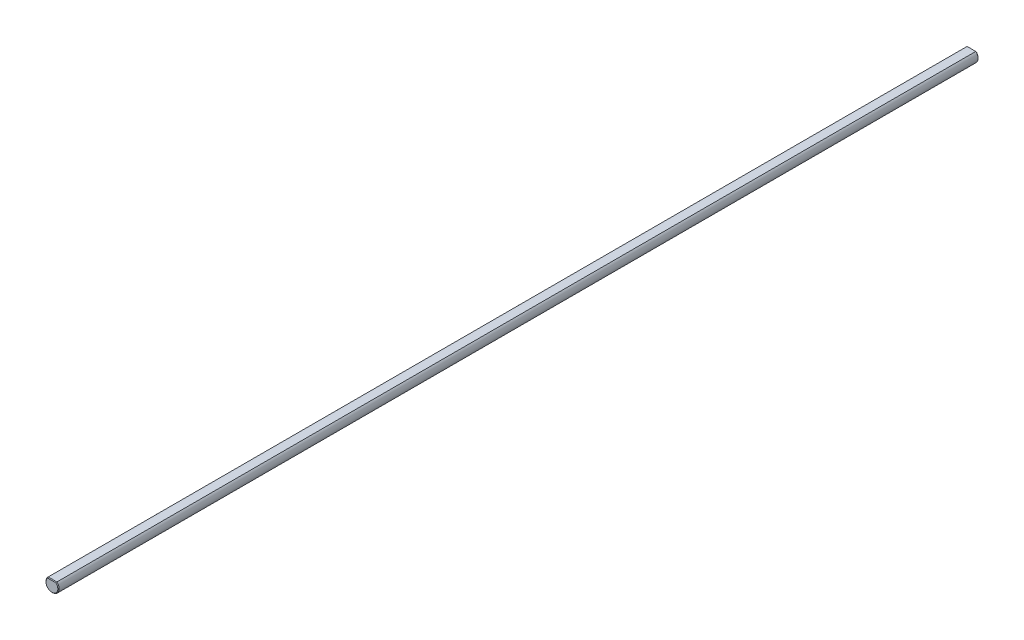
ISO-10303-21;
HEADER;
FILE_DESCRIPTION(('STEP AP214'),'2;1');
FILE_NAME('part.step','',(''),(''),'','','');
FILE_SCHEMA(('AUTOMOTIVE_DESIGN { 1 0 10303 214 1 1 1 1 }'));
ENDSEC;
DATA;
#1=APPLICATION_CONTEXT('core data for automotive mechanical design processes');
#2=APPLICATION_PROTOCOL_DEFINITION('international standard','automotive_design',2000,#1);
#3=PRODUCT_CONTEXT('',#1,'mechanical');
#4=PRODUCT('Part','Part','',(#3));
#5=PRODUCT_RELATED_PRODUCT_CATEGORY('part','',(#4));
#6=PRODUCT_DEFINITION_FORMATION('','',#4);
#7=PRODUCT_DEFINITION_CONTEXT('part definition',#1,'design');
#8=PRODUCT_DEFINITION('design','',#6,#7);
#9=PRODUCT_DEFINITION_SHAPE('','',#8);
#10=(LENGTH_UNIT() NAMED_UNIT(*) SI_UNIT(.MILLI.,.METRE.));
#11=(NAMED_UNIT(*) PLANE_ANGLE_UNIT() SI_UNIT($,.RADIAN.));
#12=(NAMED_UNIT(*) SI_UNIT($,.STERADIAN.) SOLID_ANGLE_UNIT());
#13=UNCERTAINTY_MEASURE_WITH_UNIT(LENGTH_MEASURE(1.E-05),#10,'distance_accuracy_value','');
#14=(GEOMETRIC_REPRESENTATION_CONTEXT(3) GLOBAL_UNCERTAINTY_ASSIGNED_CONTEXT((#13)) GLOBAL_UNIT_ASSIGNED_CONTEXT((#10,
#11,#12)) REPRESENTATION_CONTEXT('',''));
#15=CARTESIAN_POINT('',(0.,0.,0.));
#16=DIRECTION('',(0.,0.,1.));
#17=DIRECTION('',(1.,0.,0.));
#18=AXIS2_PLACEMENT_3D('',#15,#16,#17);
#19=CARTESIAN_POINT('',(0.,1.5,279.8));
#20=DIRECTION('',(0.,-0.707106781186597,-0.707106781186499));
#21=DIRECTION('',(0.,0.707106781186499,-0.707106781186597));
#22=AXIS2_PLACEMENT_3D('',#19,#20,#21);
#23=PLANE('',#22);
#24=CARTESIAN_POINT('',(-1.2449899597781,1.30000000003631,279.999999999965));
#25=CARTESIAN_POINT('',(-1.25833682018695,1.33326211369836,279.966737886302));
#26=CARTESIAN_POINT('',(-1.27150073004347,1.36655985043773,279.933440149563));
#27=CARTESIAN_POINT('',(-1.29746262806258,1.43322651720057,279.866773482799));
#28=CARTESIAN_POINT('',(-1.31026061680553,1.46659544711103,279.833404552889));
#29=CARTESIAN_POINT('',(-1.32287565557651,1.4999999999858,279.800000000014));
#30=B_SPLINE_CURVE_WITH_KNOTS('',3,(#24,#25,#26,#27,#28,#29),.UNSPECIFIED.,.F.,.F.,(4,2,4),(0.,
0.146686412458475,0.293372592255438),.UNSPECIFIED.);
#31=CARTESIAN_POINT('',(-1.24498995986547,1.30000000000005,279.99999999993));
#32=VERTEX_POINT('',#31);
#33=CARTESIAN_POINT('',(-1.3228756555568,1.5,279.8));
#34=VERTEX_POINT('',#33);
#35=EDGE_CURVE('E100',#32,#34,#30,.T.);
#36=ORIENTED_EDGE('',*,*,#35,.F.);
#37=DIRECTION('',(1.,0.,0.));
#38=VECTOR('',#37,1.);
#39=CARTESIAN_POINT('',(0.,1.30000000000005,280.));
#40=LINE('',#39,#38);
#41=CARTESIAN_POINT('',(1.24498995978626,1.30000000000745,279.999999999979));
#42=VERTEX_POINT('',#41);
#43=EDGE_CURVE('E76',#42,#32,#40,.F.);
#44=ORIENTED_EDGE('',*,*,#43,.F.);
#45=CARTESIAN_POINT('',(1.32287565557637,1.49999999998694,279.800000000013));
#46=CARTESIAN_POINT('',(1.31026061680422,1.46659544710851,279.833404552892));
#47=CARTESIAN_POINT('',(1.29746262806002,1.43322651719432,279.866773482806));
#48=CARTESIAN_POINT('',(1.27150073003822,1.36655985042392,279.933440149576));
#49=CARTESIAN_POINT('',(1.25833682018026,1.3332621136807,279.966737886319));
#50=CARTESIAN_POINT('',(1.24498995976989,1.30000000001474,279.999999999985));
#51=B_SPLINE_CURVE_WITH_KNOTS('',3,(#45,#46,#47,#48,#49,#50),.UNSPECIFIED.,.F.,.F.,(4,2,4),(0.,
0.146686179813228,0.29337259228794),.UNSPECIFIED.);
#52=CARTESIAN_POINT('',(1.32287565554286,1.50000000000359,279.80000000001));
#53=VERTEX_POINT('',#52);
#54=EDGE_CURVE('E21',#53,#42,#51,.T.);
#55=ORIENTED_EDGE('',*,*,#54,.F.);
#56=DIRECTION('',(1.,0.,0.));
#57=VECTOR('',#56,1.);
#58=CARTESIAN_POINT('',(0.,1.5,279.8));
#59=LINE('',#58,#57);
#60=EDGE_CURVE('E75',#34,#53,#59,.T.);
#61=ORIENTED_EDGE('',*,*,#60,.F.);
#62=EDGE_LOOP('',(#36,#44,#55,#61));
#63=FACE_BOUND('',#62,.T.);
#64=ADVANCED_FACE('F17',(#63),#23,.F.);
#65=CARTESIAN_POINT('',(0.,1.29999999999997,0.));
#66=DIRECTION('',(0.,0.707106781186449,-0.707106781186646));
#67=DIRECTION('',(0.,0.707106781186646,0.707106781186449));
#68=AXIS2_PLACEMENT_3D('',#65,#66,#67);
#69=PLANE('',#68);
#70=CARTESIAN_POINT('',(1.24498995957328,1.3000000000416,2.67935920497978E-11));
#71=CARTESIAN_POINT('',(1.25833681998276,1.33326211370927,0.0332621137018782));
#72=CARTESIAN_POINT('',(1.27150072984026,1.36655985045535,0.0665598504528936));
#73=CARTESIAN_POINT('',(1.29746262786203,1.43322651723378,0.133226517236245));
#74=CARTESIAN_POINT('',(1.31026061660665,1.46659544715312,0.166595447155577));
#75=CARTESIAN_POINT('',(1.32287565537966,1.50000000003786,0.200000000037835));
#76=B_SPLINE_CURVE_WITH_KNOTS('',3,(#70,#71,#72,#73,#74,#75),.UNSPECIFIED.,.F.,.F.,(4,2,4),(0.,
0.14668641249614,0.293372592330764),.UNSPECIFIED.);
#77=CARTESIAN_POINT('',(1.24498995959666,1.30000000002499,4.58049803777768E-11));
#78=VERTEX_POINT('',#77);
#79=CARTESIAN_POINT('',(1.32287565544854,1.5,0.199999999999978));
#80=VERTEX_POINT('',#79);
#81=EDGE_CURVE('E80',#78,#80,#76,.T.);
#82=ORIENTED_EDGE('',*,*,#81,.F.);
#83=DIRECTION('',(1.,0.,0.));
#84=VECTOR('',#83,1.);
#85=CARTESIAN_POINT('',(0.,1.30000000001525,0.));
#86=LINE('',#85,#84);
#87=CARTESIAN_POINT('',(-1.24498995959666,1.30000000002499,4.5805115463277E-11));
#88=VERTEX_POINT('',#87);
#89=EDGE_CURVE('E90',#78,#88,#86,.F.);
#90=ORIENTED_EDGE('',*,*,#89,.T.);
#91=CARTESIAN_POINT('',(-1.32287565538293,1.50000000004802,0.200000000020277));
#92=CARTESIAN_POINT('',(-1.3102606166083,1.4665954471584,0.166595447144531));
#93=CARTESIAN_POINT('',(-1.2974626278624,1.4332265172352,0.133226517230575));
#94=CARTESIAN_POINT('',(-1.27150072983877,1.36655985045106,0.0665598504556976));
#95=CARTESIAN_POINT('',(-1.25833681998067,1.33326211370314,0.0332621137077801));
#96=CARTESIAN_POINT('',(-1.24498995957093,1.30000000003462,3.46573786499828E-11));
#97=B_SPLINE_CURVE_WITH_KNOTS('',3,(#91,#92,#93,#94,#95,#96),.UNSPECIFIED.,.F.,.F.,(4,2,4),(0.,
0.146686179832529,0.293372592326598),.UNSPECIFIED.);
#98=CARTESIAN_POINT('',(-1.32287565546206,1.50000000001146,0.200000000019211));
#99=VERTEX_POINT('',#98);
#100=EDGE_CURVE('E117',#99,#88,#97,.T.);
#101=ORIENTED_EDGE('',*,*,#100,.F.);
#102=DIRECTION('',(1.,0.,0.));
#103=VECTOR('',#102,1.);
#104=CARTESIAN_POINT('',(0.,1.5,0.199999999999978));
#105=LINE('',#104,#103);
#106=EDGE_CURVE('E99',#80,#99,#105,.F.);
#107=ORIENTED_EDGE('',*,*,#106,.F.);
#108=EDGE_LOOP('',(#82,#90,#101,#107));
#109=FACE_BOUND('',#108,.T.);
#110=ADVANCED_FACE('F133',(#109),#69,.T.);
#111=CARTESIAN_POINT('',(0.,0.,279.800000000023));
#112=DIRECTION('',(0.,0.,-1.));
#113=DIRECTION('',(-1.,0.,0.));
#114=AXIS2_PLACEMENT_3D('',#111,#112,#113);
#115=CONICAL_SURFACE('',#114,2.00000000000955,0.785398163539557);
#116=CARTESIAN_POINT('',(0.,0.,279.800000000006));
#117=DIRECTION('',(0.,0.,-1.));
#118=DIRECTION('',(-1.,0.,0.));
#119=AXIS2_PLACEMENT_3D('',#116,#117,#118);
#120=CIRCLE('',#119,2.);
#121=CARTESIAN_POINT('',(2.00000000000318,0.,279.800000000015));
#122=VERTEX_POINT('',#121);
#123=EDGE_CURVE('E83',#53,#122,#120,.T.);
#124=ORIENTED_EDGE('',*,*,#123,.F.);
#125=ORIENTED_EDGE('',*,*,#54,.T.);
#126=CARTESIAN_POINT('',(0.,0.,279.999999999973));
#127=DIRECTION('',(0.,0.,-1.));
#128=DIRECTION('',(-1.,0.,0.));
#129=AXIS2_PLACEMENT_3D('',#126,#127,#128);
#130=CIRCLE('',#129,1.80000000000291);
#131=CARTESIAN_POINT('',(1.80000000005975,0.,279.999999999944));
#132=VERTEX_POINT('',#131);
#133=EDGE_CURVE('E145',#132,#42,#130,.F.);
#134=ORIENTED_EDGE('',*,*,#133,.F.);
#135=DIRECTION('',(-0.707106781287033,0.,0.707106781086062));
#136=VECTOR('',#135,1.);
#137=CARTESIAN_POINT('',(499000.,6.11098752774529E-11,-498718.199858176));
#138=LINE('',#137,#136);
#139=EDGE_CURVE('E81',#132,#122,#138,.F.);
#140=ORIENTED_EDGE('',*,*,#139,.T.);
#141=EDGE_LOOP('',(#124,#125,#134,#140));
#142=FACE_BOUND('',#141,.T.);
#143=ADVANCED_FACE('F84',(#142),#115,.T.);
#144=CARTESIAN_POINT('',(0.,0.,280.));
#145=DIRECTION('',(0.,0.,1.));
#146=DIRECTION('',(1.,0.,0.));
#147=AXIS2_PLACEMENT_3D('',#144,#145,#146);
#148=PLANE('',#147);
#149=CARTESIAN_POINT('',(0.,0.,279.999999999859));
#150=DIRECTION('',(0.,0.,-1.));
#151=DIRECTION('',(-1.,0.,0.));
#152=AXIS2_PLACEMENT_3D('',#149,#150,#151);
#153=CIRCLE('',#152,1.8000000001166);
#154=CARTESIAN_POINT('',(-1.8000000001166,0.,279.999999999887));
#155=VERTEX_POINT('',#154);
#156=EDGE_CURVE('E146',#155,#32,#153,.T.);
#157=ORIENTED_EDGE('',*,*,#156,.F.);
#158=CARTESIAN_POINT('',(0.,0.,279.999999999916));
#159=DIRECTION('',(0.,0.,-1.));
#160=DIRECTION('',(-1.,0.,0.));
#161=AXIS2_PLACEMENT_3D('',#158,#159,#160);
#162=CIRCLE('',#161,1.8000000001166);
#163=EDGE_CURVE('E104',#132,#155,#162,.T.);
#164=ORIENTED_EDGE('',*,*,#163,.F.);
#165=ORIENTED_EDGE('',*,*,#133,.T.);
#166=ORIENTED_EDGE('',*,*,#43,.T.);
#167=EDGE_LOOP('',(#157,#164,#165,#166));
#168=FACE_BOUND('',#167,.T.);
#169=ADVANCED_FACE('F159',(#168),#148,.T.);
#170=CARTESIAN_POINT('',(0.,0.,279.800000000023));
#171=DIRECTION('',(0.,0.,-1.));
#172=DIRECTION('',(-1.,0.,0.));
#173=AXIS2_PLACEMENT_3D('',#170,#171,#172);
#174=CONICAL_SURFACE('',#173,2.00000000000955,0.785398163539557);
#175=ORIENTED_EDGE('',*,*,#35,.T.);
#176=CARTESIAN_POINT('',(0.,0.,279.8));
#177=DIRECTION('',(0.,0.,-1.));
#178=DIRECTION('',(-1.,0.,0.));
#179=AXIS2_PLACEMENT_3D('',#176,#177,#178);
#180=CIRCLE('',#179,2.);
#181=CARTESIAN_POINT('',(-2.00000000000716,0.,279.800000000017));
#182=VERTEX_POINT('',#181);
#183=EDGE_CURVE('E40',#182,#34,#180,.T.);
#184=ORIENTED_EDGE('',*,*,#183,.F.);
#185=DIRECTION('',(0.707106781287033,0.,0.707106781086062));
#186=VECTOR('',#185,1.);
#187=CARTESIAN_POINT('',(-499000.,0.,-498718.199858176));
#188=LINE('',#187,#186);
#189=EDGE_CURVE('E107',#155,#182,#188,.F.);
#190=ORIENTED_EDGE('',*,*,#189,.F.);
#191=ORIENTED_EDGE('',*,*,#156,.T.);
#192=EDGE_LOOP('',(#175,#184,#190,#191));
#193=FACE_BOUND('',#192,.T.);
#194=ADVANCED_FACE('F157',(#193),#174,.T.);
#195=CARTESIAN_POINT('',(0.,1.5,280.));
#196=DIRECTION('',(0.,1.,0.));
#197=DIRECTION('',(0.,0.,1.));
#198=AXIS2_PLACEMENT_3D('',#195,#196,#197);
#199=PLANE('',#198);
#200=DIRECTION('',(0.,0.,-1.));
#201=VECTOR('',#200,1.);
#202=CARTESIAN_POINT('',(1.32287565550935,1.50000000002023,280.));
#203=LINE('',#202,#201);
#204=EDGE_CURVE('E89',#80,#53,#203,.F.);
#205=ORIENTED_EDGE('',*,*,#204,.F.);
#206=ORIENTED_EDGE('',*,*,#106,.T.);
#207=DIRECTION('',(0.,0.,-1.));
#208=VECTOR('',#207,1.);
#209=CARTESIAN_POINT('',(-1.32287565554608,1.49999999998784,280.));
#210=LINE('',#209,#208);
#211=EDGE_CURVE('E98',#34,#99,#210,.T.);
#212=ORIENTED_EDGE('',*,*,#211,.F.);
#213=ORIENTED_EDGE('',*,*,#60,.T.);
#214=EDGE_LOOP('',(#205,#206,#212,#213));
#215=FACE_BOUND('',#214,.T.);
#216=ADVANCED_FACE('F95',(#215),#199,.T.);
#217=CARTESIAN_POINT('',(0.,0.,0.));
#218=DIRECTION('',(0.,0.,1.));
#219=DIRECTION('',(1.,0.,0.));
#220=AXIS2_PLACEMENT_3D('',#217,#218,#219);
#221=PLANE('',#220);
#222=ORIENTED_EDGE('',*,*,#89,.F.);
#223=CARTESIAN_POINT('',(0.,0.,5.6843418860808E-11));
#224=DIRECTION('',(0.,0.,1.));
#225=DIRECTION('',(0.,-1.,0.));
#226=AXIS2_PLACEMENT_3D('',#223,#224,#225);
#227=CIRCLE('',#226,1.79999999988922);
#228=EDGE_CURVE('E115',#88,#78,#227,.T.);
#229=ORIENTED_EDGE('',*,*,#228,.F.);
#230=EDGE_LOOP('',(#222,#229));
#231=FACE_BOUND('',#230,.T.);
#232=ADVANCED_FACE('F165',(#231),#221,.F.);
#233=CARTESIAN_POINT('',(0.,0.,279.800000000023));
#234=DIRECTION('',(0.,0.,-1.));
#235=DIRECTION('',(-1.,0.,0.));
#236=AXIS2_PLACEMENT_3D('',#233,#234,#235);
#237=CONICAL_SURFACE('',#236,2.00000000000955,0.785398163397448);
#238=ORIENTED_EDGE('',*,*,#189,.T.);
#239=CARTESIAN_POINT('',(0.,0.,279.8));
#240=DIRECTION('',(0.,0.,-1.));
#241=DIRECTION('',(-1.,0.,0.));
#242=AXIS2_PLACEMENT_3D('',#239,#240,#241);
#243=CIRCLE('',#242,2.);
#244=EDGE_CURVE('E31',#122,#182,#243,.T.);
#245=ORIENTED_EDGE('',*,*,#244,.F.);
#246=ORIENTED_EDGE('',*,*,#139,.F.);
#247=ORIENTED_EDGE('',*,*,#163,.T.);
#248=EDGE_LOOP('',(#238,#245,#246,#247));
#249=FACE_BOUND('',#248,.T.);
#250=ADVANCED_FACE('F155',(#249),#237,.T.);
#251=CARTESIAN_POINT('',(0.,0.,0.199999999949796));
#252=DIRECTION('',(0.,0.,1.));
#253=DIRECTION('',(0.,-1.,0.));
#254=AXIS2_PLACEMENT_3D('',#251,#252,#253);
#255=CONICAL_SURFACE('',#254,1.99999999983902,0.785398163539557);
#256=ORIENTED_EDGE('',*,*,#228,.T.);
#257=ORIENTED_EDGE('',*,*,#81,.T.);
#258=CARTESIAN_POINT('',(0.,0.,0.199999999999978));
#259=DIRECTION('',(0.,0.,-1.));
#260=DIRECTION('',(-1.,0.,0.));
#261=AXIS2_PLACEMENT_3D('',#258,#259,#260);
#262=CIRCLE('',#261,2.);
#263=EDGE_CURVE('E10',#99,#80,#262,.F.);
#264=ORIENTED_EDGE('',*,*,#263,.F.);
#265=ORIENTED_EDGE('',*,*,#100,.T.);
#266=EDGE_LOOP('',(#256,#257,#264,#265));
#267=FACE_BOUND('',#266,.T.);
#268=ADVANCED_FACE('F129',(#267),#255,.T.);
#269=CARTESIAN_POINT('',(0.,0.,280.));
#270=DIRECTION('',(0.,0.,-1.));
#271=DIRECTION('',(-1.,0.,0.));
#272=AXIS2_PLACEMENT_3D('',#269,#270,#271);
#273=CYLINDRICAL_SURFACE('',#272,2.);
#274=ORIENTED_EDGE('',*,*,#244,.T.);
#275=ORIENTED_EDGE('',*,*,#183,.T.);
#276=ORIENTED_EDGE('',*,*,#211,.T.);
#277=ORIENTED_EDGE('',*,*,#263,.T.);
#278=ORIENTED_EDGE('',*,*,#204,.T.);
#279=ORIENTED_EDGE('',*,*,#123,.T.);
#280=EDGE_LOOP('',(#274,#275,#276,#277,#278,#279));
#281=FACE_BOUND('',#280,.T.);
#282=ADVANCED_FACE('F102',(#281),#273,.T.);
#283=CLOSED_SHELL('',(#64,#110,#143,#169,#194,#216,#232,#250,#268,#282));
#284=MANIFOLD_SOLID_BREP('B1',#283);
#285=ADVANCED_BREP_SHAPE_REPRESENTATION('',(#18,#284),#14);
#286=SHAPE_DEFINITION_REPRESENTATION(#9,#285);
ENDSEC;
END-ISO-10303-21;
